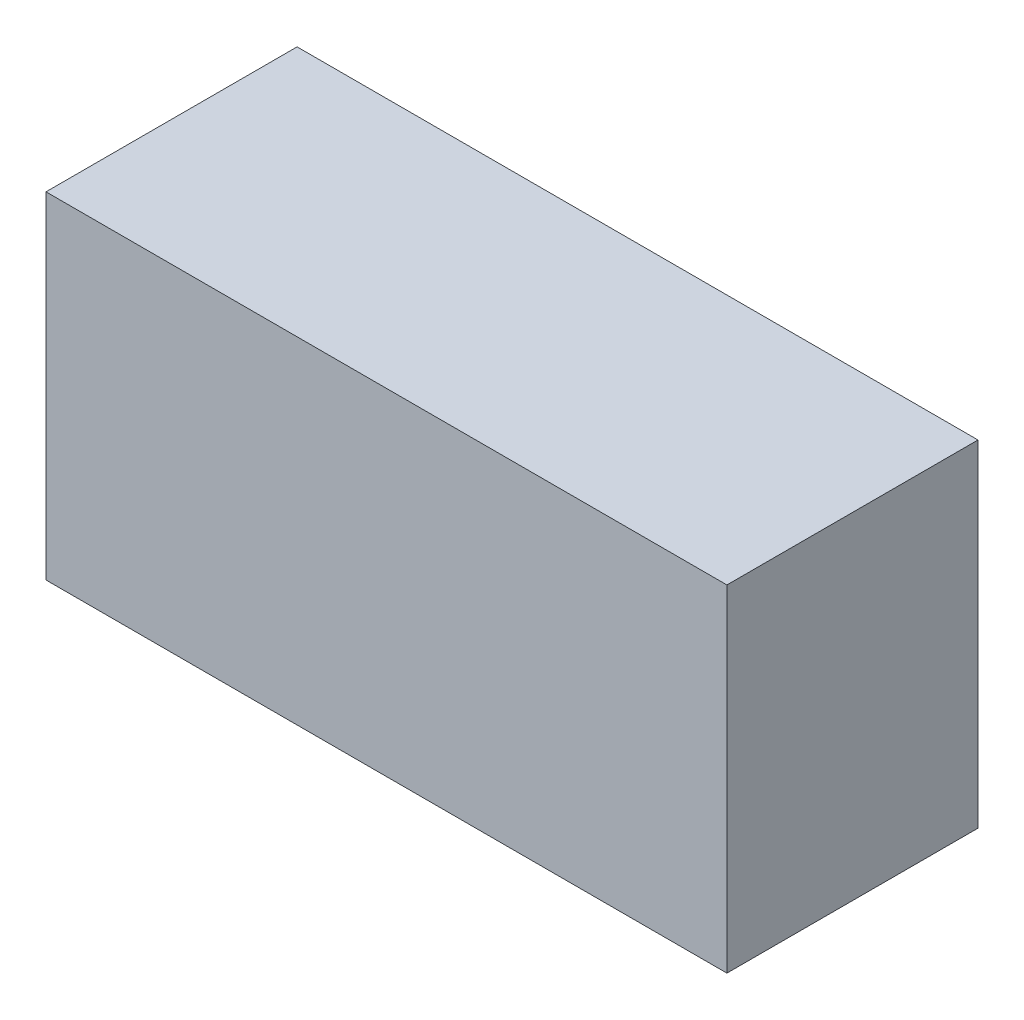
ISO-10303-21;
HEADER;
FILE_DESCRIPTION(('STEP AP214'),'2;1');
FILE_NAME('part.step','',(''),(''),'','','');
FILE_SCHEMA(('AUTOMOTIVE_DESIGN { 1 0 10303 214 1 1 1 1 }'));
ENDSEC;
DATA;
#1=APPLICATION_CONTEXT('core data for automotive mechanical design processes');
#2=APPLICATION_PROTOCOL_DEFINITION('international standard','automotive_design',2000,#1);
#3=PRODUCT_CONTEXT('',#1,'mechanical');
#4=PRODUCT('Part','Part','',(#3));
#5=PRODUCT_RELATED_PRODUCT_CATEGORY('part','',(#4));
#6=PRODUCT_DEFINITION_FORMATION('','',#4);
#7=PRODUCT_DEFINITION_CONTEXT('part definition',#1,'design');
#8=PRODUCT_DEFINITION('design','',#6,#7);
#9=PRODUCT_DEFINITION_SHAPE('','',#8);
#10=(LENGTH_UNIT() NAMED_UNIT(*) SI_UNIT(.MILLI.,.METRE.));
#11=(NAMED_UNIT(*) PLANE_ANGLE_UNIT() SI_UNIT($,.RADIAN.));
#12=(NAMED_UNIT(*) SI_UNIT($,.STERADIAN.) SOLID_ANGLE_UNIT());
#13=UNCERTAINTY_MEASURE_WITH_UNIT(LENGTH_MEASURE(1.E-05),#10,'distance_accuracy_value','');
#14=(GEOMETRIC_REPRESENTATION_CONTEXT(3) GLOBAL_UNCERTAINTY_ASSIGNED_CONTEXT((#13)) GLOBAL_UNIT_ASSIGNED_CONTEXT((#10,
#11,#12)) REPRESENTATION_CONTEXT('',''));
#15=CARTESIAN_POINT('',(0.,0.,0.));
#16=DIRECTION('',(0.,0.,1.));
#17=DIRECTION('',(1.,0.,0.));
#18=AXIS2_PLACEMENT_3D('',#15,#16,#17);
#19=CARTESIAN_POINT('',(-0.8,0.395,0.595));
#20=DIRECTION('',(0.,0.,1.));
#21=DIRECTION('',(1.,0.,0.));
#22=AXIS2_PLACEMENT_3D('',#19,#20,#21);
#23=PLANE('',#22);
#24=DIRECTION('',(0.,1.,0.));
#25=VECTOR('',#24,1.);
#26=CARTESIAN_POINT('',(0.8,0.395,0.595));
#27=LINE('',#26,#25);
#28=CARTESIAN_POINT('',(0.8,0.395,0.595));
#29=VERTEX_POINT('',#28);
#30=CARTESIAN_POINT('',(0.8,-0.395,0.595));
#31=VERTEX_POINT('',#30);
#32=EDGE_CURVE('E53',#29,#31,#27,.F.);
#33=ORIENTED_EDGE('',*,*,#32,.F.);
#34=DIRECTION('',(1.,0.,0.));
#35=VECTOR('',#34,1.);
#36=CARTESIAN_POINT('',(-0.8,0.395,0.595));
#37=LINE('',#36,#35);
#38=CARTESIAN_POINT('',(-0.8,0.395,0.595));
#39=VERTEX_POINT('',#38);
#40=EDGE_CURVE('E68',#39,#29,#37,.T.);
#41=ORIENTED_EDGE('',*,*,#40,.F.);
#42=DIRECTION('',(0.,1.,0.));
#43=VECTOR('',#42,1.);
#44=CARTESIAN_POINT('',(-0.8,-0.395,0.595));
#45=LINE('',#44,#43);
#46=CARTESIAN_POINT('',(-0.8,-0.395,0.595));
#47=VERTEX_POINT('',#46);
#48=EDGE_CURVE('E20',#47,#39,#45,.T.);
#49=ORIENTED_EDGE('',*,*,#48,.F.);
#50=DIRECTION('',(1.,0.,0.));
#51=VECTOR('',#50,1.);
#52=CARTESIAN_POINT('',(0.8,-0.395,0.595));
#53=LINE('',#52,#51);
#54=EDGE_CURVE('E58',#31,#47,#53,.F.);
#55=ORIENTED_EDGE('',*,*,#54,.F.);
#56=EDGE_LOOP('',(#33,#41,#49,#55));
#57=FACE_BOUND('',#56,.T.);
#58=ADVANCED_FACE('F17',(#57),#23,.T.);
#59=CARTESIAN_POINT('',(-0.8,-0.395,0.005));
#60=DIRECTION('',(-1.,0.,0.));
#61=DIRECTION('',(0.,0.,1.));
#62=AXIS2_PLACEMENT_3D('',#59,#60,#61);
#63=PLANE('',#62);
#64=DIRECTION('',(0.,0.,1.));
#65=VECTOR('',#64,1.);
#66=CARTESIAN_POINT('',(-0.8,0.395,0.005));
#67=LINE('',#66,#65);
#68=CARTESIAN_POINT('',(-0.8,0.395,0.005));
#69=VERTEX_POINT('',#68);
#70=EDGE_CURVE('E79',#69,#39,#67,.T.);
#71=ORIENTED_EDGE('',*,*,#70,.F.);
#72=DIRECTION('',(0.,1.,0.));
#73=VECTOR('',#72,1.);
#74=CARTESIAN_POINT('',(-0.8,0.395,0.005));
#75=LINE('',#74,#73);
#76=CARTESIAN_POINT('',(-0.8,-0.395,0.005));
#77=VERTEX_POINT('',#76);
#78=EDGE_CURVE('E74',#69,#77,#75,.F.);
#79=ORIENTED_EDGE('',*,*,#78,.T.);
#80=DIRECTION('',(0.,0.,-1.));
#81=VECTOR('',#80,1.);
#82=CARTESIAN_POINT('',(-0.8,-0.395,0.005));
#83=LINE('',#82,#81);
#84=EDGE_CURVE('E63',#47,#77,#83,.T.);
#85=ORIENTED_EDGE('',*,*,#84,.F.);
#86=ORIENTED_EDGE('',*,*,#48,.T.);
#87=EDGE_LOOP('',(#71,#79,#85,#86));
#88=FACE_BOUND('',#87,.T.);
#89=ADVANCED_FACE('F73',(#88),#63,.T.);
#90=CARTESIAN_POINT('',(0.8,-0.395,0.005));
#91=DIRECTION('',(0.,-1.,0.));
#92=DIRECTION('',(0.,0.,-1.));
#93=AXIS2_PLACEMENT_3D('',#90,#91,#92);
#94=PLANE('',#93);
#95=ORIENTED_EDGE('',*,*,#84,.T.);
#96=DIRECTION('',(1.,0.,0.));
#97=VECTOR('',#96,1.);
#98=CARTESIAN_POINT('',(-0.8,-0.395,0.005));
#99=LINE('',#98,#97);
#100=CARTESIAN_POINT('',(0.8,-0.395,0.005));
#101=VERTEX_POINT('',#100);
#102=EDGE_CURVE('E84',#77,#101,#99,.T.);
#103=ORIENTED_EDGE('',*,*,#102,.T.);
#104=DIRECTION('',(0.,0.,-1.));
#105=VECTOR('',#104,1.);
#106=CARTESIAN_POINT('',(0.8,-0.395,0.005));
#107=LINE('',#106,#105);
#108=EDGE_CURVE('E65',#31,#101,#107,.T.);
#109=ORIENTED_EDGE('',*,*,#108,.F.);
#110=ORIENTED_EDGE('',*,*,#54,.T.);
#111=EDGE_LOOP('',(#95,#103,#109,#110));
#112=FACE_BOUND('',#111,.T.);
#113=ADVANCED_FACE('F60',(#112),#94,.T.);
#114=CARTESIAN_POINT('',(0.8,0.395,0.005));
#115=DIRECTION('',(1.,0.,0.));
#116=DIRECTION('',(0.,0.,-1.));
#117=AXIS2_PLACEMENT_3D('',#114,#115,#116);
#118=PLANE('',#117);
#119=ORIENTED_EDGE('',*,*,#108,.T.);
#120=DIRECTION('',(0.,1.,0.));
#121=VECTOR('',#120,1.);
#122=CARTESIAN_POINT('',(0.8,0.395,0.005));
#123=LINE('',#122,#121);
#124=CARTESIAN_POINT('',(0.8,0.395,0.005));
#125=VERTEX_POINT('',#124);
#126=EDGE_CURVE('E26',#101,#125,#123,.T.);
#127=ORIENTED_EDGE('',*,*,#126,.T.);
#128=DIRECTION('',(0.,0.,1.));
#129=VECTOR('',#128,1.);
#130=CARTESIAN_POINT('',(0.8,0.395,0.005));
#131=LINE('',#130,#129);
#132=EDGE_CURVE('E34',#29,#125,#131,.F.);
#133=ORIENTED_EDGE('',*,*,#132,.F.);
#134=ORIENTED_EDGE('',*,*,#32,.T.);
#135=EDGE_LOOP('',(#119,#127,#133,#134));
#136=FACE_BOUND('',#135,.T.);
#137=ADVANCED_FACE('F88',(#136),#118,.T.);
#138=CARTESIAN_POINT('',(-0.8,0.395,0.005));
#139=DIRECTION('',(0.,1.,0.));
#140=DIRECTION('',(0.,0.,1.));
#141=AXIS2_PLACEMENT_3D('',#138,#139,#140);
#142=PLANE('',#141);
#143=ORIENTED_EDGE('',*,*,#132,.T.);
#144=DIRECTION('',(1.,0.,0.));
#145=VECTOR('',#144,1.);
#146=CARTESIAN_POINT('',(-0.8,0.395,0.005));
#147=LINE('',#146,#145);
#148=EDGE_CURVE('E11',#125,#69,#147,.F.);
#149=ORIENTED_EDGE('',*,*,#148,.T.);
#150=ORIENTED_EDGE('',*,*,#70,.T.);
#151=ORIENTED_EDGE('',*,*,#40,.T.);
#152=EDGE_LOOP('',(#143,#149,#150,#151));
#153=FACE_BOUND('',#152,.T.);
#154=ADVANCED_FACE('F91',(#153),#142,.T.);
#155=CARTESIAN_POINT('',(-0.8,0.395,0.005));
#156=DIRECTION('',(0.,0.,1.));
#157=DIRECTION('',(1.,0.,0.));
#158=AXIS2_PLACEMENT_3D('',#155,#156,#157);
#159=PLANE('',#158);
#160=ORIENTED_EDGE('',*,*,#126,.F.);
#161=ORIENTED_EDGE('',*,*,#102,.F.);
#162=ORIENTED_EDGE('',*,*,#78,.F.);
#163=ORIENTED_EDGE('',*,*,#148,.F.);
#164=EDGE_LOOP('',(#160,#161,#162,#163));
#165=FACE_BOUND('',#164,.T.);
#166=ADVANCED_FACE('F90',(#165),#159,.F.);
#167=CLOSED_SHELL('',(#58,#89,#113,#137,#154,#166));
#168=MANIFOLD_SOLID_BREP('B1',#167);
#169=ADVANCED_BREP_SHAPE_REPRESENTATION('',(#18,#168),#14);
#170=SHAPE_DEFINITION_REPRESENTATION(#9,#169);
ENDSEC;
END-ISO-10303-21;
